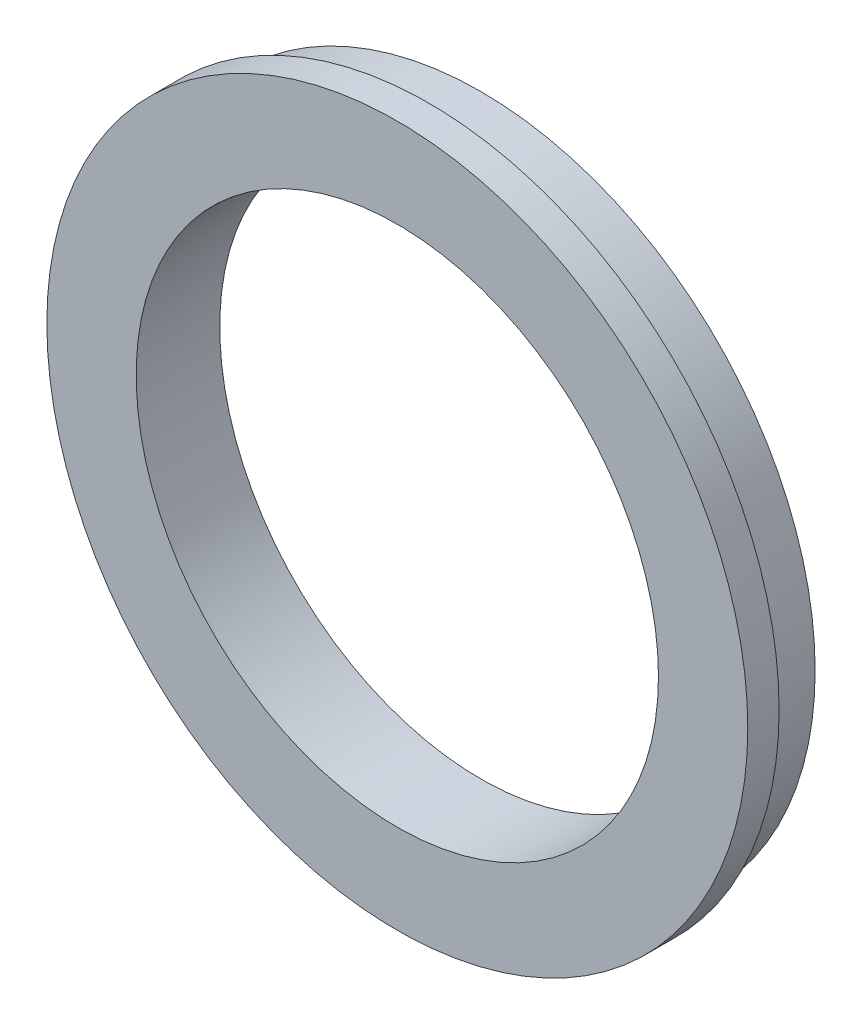
ISO-10303-21;
HEADER;
FILE_DESCRIPTION(('STEP AP214'),'2;1');
FILE_NAME('part.step','',(''),(''),'','','');
FILE_SCHEMA(('AUTOMOTIVE_DESIGN { 1 0 10303 214 1 1 1 1 }'));
ENDSEC;
DATA;
#1=APPLICATION_CONTEXT('core data for automotive mechanical design processes');
#2=APPLICATION_PROTOCOL_DEFINITION('international standard','automotive_design',2000,#1);
#3=PRODUCT_CONTEXT('',#1,'mechanical');
#4=PRODUCT('Part','Part','',(#3));
#5=PRODUCT_RELATED_PRODUCT_CATEGORY('part','',(#4));
#6=PRODUCT_DEFINITION_FORMATION('','',#4);
#7=PRODUCT_DEFINITION_CONTEXT('part definition',#1,'design');
#8=PRODUCT_DEFINITION('design','',#6,#7);
#9=PRODUCT_DEFINITION_SHAPE('','',#8);
#10=(LENGTH_UNIT() NAMED_UNIT(*) SI_UNIT(.MILLI.,.METRE.));
#11=(NAMED_UNIT(*) PLANE_ANGLE_UNIT() SI_UNIT($,.RADIAN.));
#12=(NAMED_UNIT(*) SI_UNIT($,.STERADIAN.) SOLID_ANGLE_UNIT());
#13=UNCERTAINTY_MEASURE_WITH_UNIT(LENGTH_MEASURE(1.E-05),#10,'distance_accuracy_value','');
#14=(GEOMETRIC_REPRESENTATION_CONTEXT(3) GLOBAL_UNCERTAINTY_ASSIGNED_CONTEXT((#13)) GLOBAL_UNIT_ASSIGNED_CONTEXT((#10,
#11,#12)) REPRESENTATION_CONTEXT('',''));
#15=CARTESIAN_POINT('',(0.,0.,0.));
#16=DIRECTION('',(0.,0.,1.));
#17=DIRECTION('',(1.,0.,0.));
#18=AXIS2_PLACEMENT_3D('',#15,#16,#17);
#19=CARTESIAN_POINT('',(0.,0.,4.));
#20=DIRECTION('',(0.,0.,-1.));
#21=DIRECTION('',(-1.,0.,0.));
#22=AXIS2_PLACEMENT_3D('',#19,#20,#21);
#23=CYLINDRICAL_SURFACE('',#22,16.);
#24=CARTESIAN_POINT('',(0.,0.,0.));
#25=DIRECTION('',(0.,0.,1.));
#26=DIRECTION('',(1.,0.,0.));
#27=AXIS2_PLACEMENT_3D('',#24,#25,#26);
#28=CIRCLE('',#27,16.);
#29=CARTESIAN_POINT('',(16.,0.,0.));
#30=VERTEX_POINT('',#29);
#31=EDGE_CURVE('E38',#30,#30,#28,.T.);
#32=ORIENTED_EDGE('',*,*,#31,.T.);
#33=EDGE_LOOP('',(#32));
#34=FACE_BOUND('',#33,.T.);
#35=CARTESIAN_POINT('',(0.,0.,2.5));
#36=DIRECTION('',(0.,0.,1.));
#37=DIRECTION('',(1.,0.,0.));
#38=AXIS2_PLACEMENT_3D('',#35,#36,#37);
#39=CIRCLE('',#38,16.);
#40=CARTESIAN_POINT('',(16.,0.,2.5));
#41=VERTEX_POINT('',#40);
#42=EDGE_CURVE('E10',#41,#41,#39,.T.);
#43=ORIENTED_EDGE('',*,*,#42,.F.);
#44=EDGE_LOOP('',(#43));
#45=FACE_BOUND('',#44,.T.);
#46=ADVANCED_FACE('F35',(#34,#45),#23,.T.);
#47=CARTESIAN_POINT('',(0.,0.,4.));
#48=DIRECTION('',(0.,0.,1.));
#49=DIRECTION('',(1.,0.,0.));
#50=AXIS2_PLACEMENT_3D('',#47,#48,#49);
#51=PLANE('',#50);
#52=CARTESIAN_POINT('',(0.,0.,4.));
#53=DIRECTION('',(0.,0.,1.));
#54=DIRECTION('',(1.,0.,0.));
#55=AXIS2_PLACEMENT_3D('',#52,#53,#54);
#56=CIRCLE('',#55,12.5);
#57=CARTESIAN_POINT('',(12.5,0.,4.));
#58=VERTEX_POINT('',#57);
#59=EDGE_CURVE('E46',#58,#58,#56,.T.);
#60=ORIENTED_EDGE('',*,*,#59,.F.);
#61=EDGE_LOOP('',(#60));
#62=FACE_BOUND('',#61,.T.);
#63=CARTESIAN_POINT('',(0.,0.,4.));
#64=DIRECTION('',(0.,0.,1.));
#65=DIRECTION('',(1.,0.,0.));
#66=AXIS2_PLACEMENT_3D('',#63,#64,#65);
#67=CIRCLE('',#66,16.775);
#68=CARTESIAN_POINT('',(16.775,0.,4.));
#69=VERTEX_POINT('',#68);
#70=EDGE_CURVE('E49',#69,#69,#67,.T.);
#71=ORIENTED_EDGE('',*,*,#70,.T.);
#72=EDGE_LOOP('',(#71));
#73=FACE_BOUND('',#72,.T.);
#74=ADVANCED_FACE('F63',(#62,#73),#51,.T.);
#75=CARTESIAN_POINT('',(0.,0.,0.));
#76=DIRECTION('',(0.,0.,1.));
#77=DIRECTION('',(1.,0.,0.));
#78=AXIS2_PLACEMENT_3D('',#75,#76,#77);
#79=PLANE('',#78);
#80=ORIENTED_EDGE('',*,*,#31,.F.);
#81=EDGE_LOOP('',(#80));
#82=FACE_BOUND('',#81,.T.);
#83=CARTESIAN_POINT('',(0.,0.,0.));
#84=DIRECTION('',(0.,0.,1.));
#85=DIRECTION('',(1.,0.,0.));
#86=AXIS2_PLACEMENT_3D('',#83,#84,#85);
#87=CIRCLE('',#86,12.5);
#88=CARTESIAN_POINT('',(12.5,0.,0.));
#89=VERTEX_POINT('',#88);
#90=EDGE_CURVE('E52',#89,#89,#87,.T.);
#91=ORIENTED_EDGE('',*,*,#90,.T.);
#92=EDGE_LOOP('',(#91));
#93=FACE_BOUND('',#92,.T.);
#94=ADVANCED_FACE('F82',(#82,#93),#79,.F.);
#95=CARTESIAN_POINT('',(0.,0.,4.));
#96=DIRECTION('',(0.,0.,-1.));
#97=DIRECTION('',(-1.,0.,0.));
#98=AXIS2_PLACEMENT_3D('',#95,#96,#97);
#99=CYLINDRICAL_SURFACE('',#98,12.5);
#100=ORIENTED_EDGE('',*,*,#59,.T.);
#101=EDGE_LOOP('',(#100));
#102=FACE_BOUND('',#101,.T.);
#103=ORIENTED_EDGE('',*,*,#90,.F.);
#104=EDGE_LOOP('',(#103));
#105=FACE_BOUND('',#104,.T.);
#106=ADVANCED_FACE('F72',(#102,#105),#99,.F.);
#107=CARTESIAN_POINT('',(0.,0.,2.5));
#108=DIRECTION('',(0.,0.,1.));
#109=DIRECTION('',(1.,0.,0.));
#110=AXIS2_PLACEMENT_3D('',#107,#108,#109);
#111=PLANE('',#110);
#112=CARTESIAN_POINT('',(0.,0.,2.5));
#113=DIRECTION('',(0.,0.,1.));
#114=DIRECTION('',(1.,0.,0.));
#115=AXIS2_PLACEMENT_3D('',#112,#113,#114);
#116=CIRCLE('',#115,16.775);
#117=CARTESIAN_POINT('',(16.775,0.,2.5));
#118=VERTEX_POINT('',#117);
#119=EDGE_CURVE('E54',#118,#118,#116,.T.);
#120=ORIENTED_EDGE('',*,*,#119,.F.);
#121=EDGE_LOOP('',(#120));
#122=FACE_BOUND('',#121,.T.);
#123=ORIENTED_EDGE('',*,*,#42,.T.);
#124=EDGE_LOOP('',(#123));
#125=FACE_BOUND('',#124,.T.);
#126=ADVANCED_FACE('F67',(#122,#125),#111,.F.);
#127=CARTESIAN_POINT('',(0.,0.,2.5));
#128=DIRECTION('',(0.,0.,1.));
#129=DIRECTION('',(1.,0.,0.));
#130=AXIS2_PLACEMENT_3D('',#127,#128,#129);
#131=CYLINDRICAL_SURFACE('',#130,16.775);
#132=ORIENTED_EDGE('',*,*,#119,.T.);
#133=EDGE_LOOP('',(#132));
#134=FACE_BOUND('',#133,.T.);
#135=ORIENTED_EDGE('',*,*,#70,.F.);
#136=EDGE_LOOP('',(#135));
#137=FACE_BOUND('',#136,.T.);
#138=ADVANCED_FACE('F65',(#134,#137),#131,.T.);
#139=CLOSED_SHELL('',(#46,#74,#94,#106,#126,#138));
#140=MANIFOLD_SOLID_BREP('B2',#139);
#141=ADVANCED_BREP_SHAPE_REPRESENTATION('',(#18,#140),#14);
#142=SHAPE_DEFINITION_REPRESENTATION(#9,#141);
ENDSEC;
END-ISO-10303-21;
